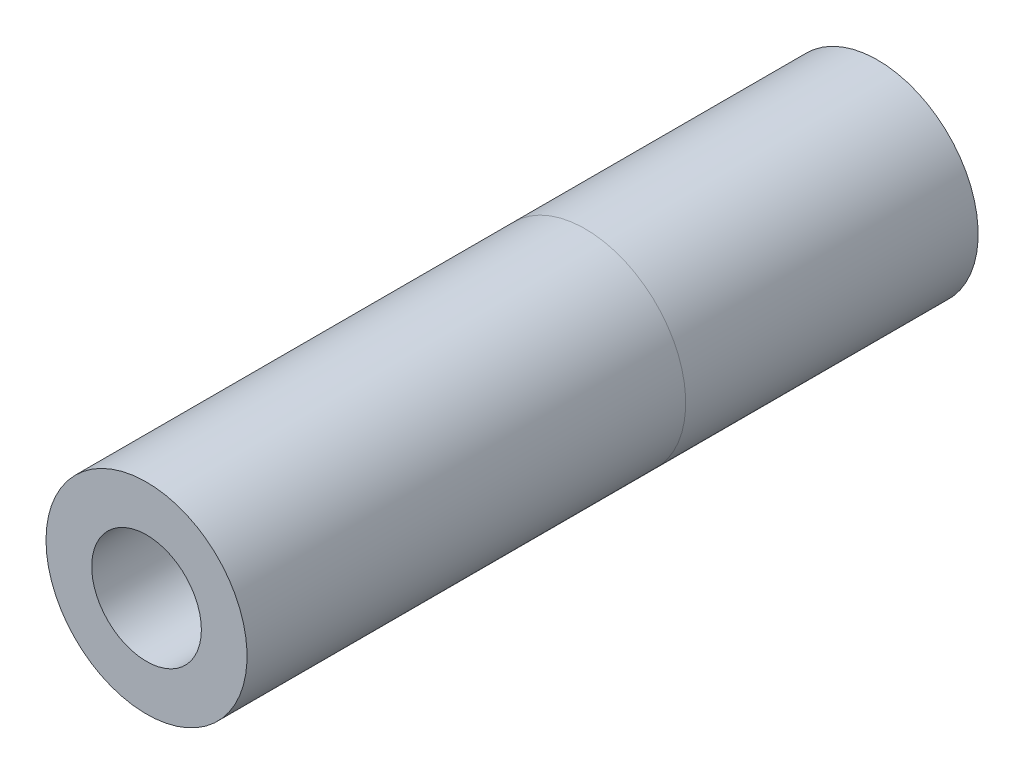
ISO-10303-21;
HEADER;
FILE_DESCRIPTION(('STEP AP214'),'2;1');
FILE_NAME('part.step','',(''),(''),'','','');
FILE_SCHEMA(('AUTOMOTIVE_DESIGN { 1 0 10303 214 1 1 1 1 }'));
ENDSEC;
DATA;
#1=APPLICATION_CONTEXT('core data for automotive mechanical design processes');
#2=APPLICATION_PROTOCOL_DEFINITION('international standard','automotive_design',2000,#1);
#3=PRODUCT_CONTEXT('',#1,'mechanical');
#4=PRODUCT('Part','Part','',(#3));
#5=PRODUCT_RELATED_PRODUCT_CATEGORY('part','',(#4));
#6=PRODUCT_DEFINITION_FORMATION('','',#4);
#7=PRODUCT_DEFINITION_CONTEXT('part definition',#1,'design');
#8=PRODUCT_DEFINITION('design','',#6,#7);
#9=PRODUCT_DEFINITION_SHAPE('','',#8);
#10=(LENGTH_UNIT() NAMED_UNIT(*) SI_UNIT(.MILLI.,.METRE.));
#11=(NAMED_UNIT(*) PLANE_ANGLE_UNIT() SI_UNIT($,.RADIAN.));
#12=(NAMED_UNIT(*) SI_UNIT($,.STERADIAN.) SOLID_ANGLE_UNIT());
#13=UNCERTAINTY_MEASURE_WITH_UNIT(LENGTH_MEASURE(1.E-05),#10,'distance_accuracy_value','');
#14=(GEOMETRIC_REPRESENTATION_CONTEXT(3) GLOBAL_UNCERTAINTY_ASSIGNED_CONTEXT((#13)) GLOBAL_UNIT_ASSIGNED_CONTEXT((#10,
#11,#12)) REPRESENTATION_CONTEXT('',''));
#15=CARTESIAN_POINT('',(0.,0.,0.));
#16=DIRECTION('',(0.,0.,1.));
#17=DIRECTION('',(1.,0.,0.));
#18=AXIS2_PLACEMENT_3D('',#15,#16,#17);
#19=CARTESIAN_POINT('',(0.,0.,0.));
#20=DIRECTION('',(0.,0.,-1.));
#21=DIRECTION('',(-1.,0.,0.));
#22=AXIS2_PLACEMENT_3D('',#19,#20,#21);
#23=PLANE('',#22);
#24=CARTESIAN_POINT('',(0.,0.,0.));
#25=DIRECTION('',(0.,0.,-1.));
#26=DIRECTION('',(-1.,0.,0.));
#27=AXIS2_PLACEMENT_3D('',#24,#25,#26);
#28=CIRCLE('',#27,4.7625);
#29=CARTESIAN_POINT('',(-4.7625,0.,0.));
#30=VERTEX_POINT('',#29);
#31=EDGE_CURVE('E79',#30,#30,#28,.T.);
#32=ORIENTED_EDGE('',*,*,#31,.F.);
#33=EDGE_LOOP('',(#32));
#34=FACE_BOUND('',#33,.T.);
#35=CARTESIAN_POINT('',(0.,0.,0.));
#36=DIRECTION('',(0.,0.,-1.));
#37=DIRECTION('',(-1.,0.,0.));
#38=AXIS2_PLACEMENT_3D('',#35,#36,#37);
#39=CIRCLE('',#38,8.73125);
#40=CARTESIAN_POINT('',(-8.73125,0.,0.));
#41=VERTEX_POINT('',#40);
#42=EDGE_CURVE('E75',#41,#41,#39,.T.);
#43=ORIENTED_EDGE('',*,*,#42,.T.);
#44=EDGE_LOOP('',(#43));
#45=FACE_BOUND('',#44,.T.);
#46=ADVANCED_FACE('F65',(#34,#45),#23,.T.);
#47=CARTESIAN_POINT('',(0.,0.,63.5));
#48=DIRECTION('',(0.,0.,-1.));
#49=DIRECTION('',(-1.,0.,0.));
#50=AXIS2_PLACEMENT_3D('',#47,#48,#49);
#51=PLANE('',#50);
#52=CARTESIAN_POINT('',(0.,0.,63.5));
#53=DIRECTION('',(0.,0.,-1.));
#54=DIRECTION('',(-1.,0.,0.));
#55=AXIS2_PLACEMENT_3D('',#52,#53,#54);
#56=CIRCLE('',#55,4.7625);
#57=CARTESIAN_POINT('',(4.7625,0.,63.5));
#58=VERTEX_POINT('',#57);
#59=EDGE_CURVE('E84',#58,#58,#56,.T.);
#60=ORIENTED_EDGE('',*,*,#59,.T.);
#61=EDGE_LOOP('',(#60));
#62=FACE_BOUND('',#61,.T.);
#63=CARTESIAN_POINT('',(0.,0.,63.5));
#64=DIRECTION('',(0.,0.,-1.));
#65=DIRECTION('',(-1.,0.,0.));
#66=AXIS2_PLACEMENT_3D('',#63,#64,#65);
#67=CIRCLE('',#66,8.73125);
#68=CARTESIAN_POINT('',(-8.73125,0.,63.5));
#69=VERTEX_POINT('',#68);
#70=EDGE_CURVE('E11',#69,#69,#67,.T.);
#71=ORIENTED_EDGE('',*,*,#70,.F.);
#72=EDGE_LOOP('',(#71));
#73=FACE_BOUND('',#72,.T.);
#74=ADVANCED_FACE('F91',(#62,#73),#51,.F.);
#75=CARTESIAN_POINT('',(0.,0.,0.));
#76=DIRECTION('',(0.,0.,1.));
#77=DIRECTION('',(1.,0.,0.));
#78=AXIS2_PLACEMENT_3D('',#75,#76,#77);
#79=CYLINDRICAL_SURFACE('',#78,8.73125);
#80=CARTESIAN_POINT('',(0.,0.,25.4));
#81=DIRECTION('',(0.,0.,-1.));
#82=DIRECTION('',(-1.,0.,0.));
#83=AXIS2_PLACEMENT_3D('',#80,#81,#82);
#84=CIRCLE('',#83,8.73125);
#85=CARTESIAN_POINT('',(-8.73125,0.,25.4));
#86=VERTEX_POINT('',#85);
#87=EDGE_CURVE('E71',#86,#86,#84,.T.);
#88=ORIENTED_EDGE('',*,*,#87,.T.);
#89=EDGE_LOOP('',(#88));
#90=FACE_BOUND('',#89,.T.);
#91=ORIENTED_EDGE('',*,*,#42,.F.);
#92=EDGE_LOOP('',(#91));
#93=FACE_BOUND('',#92,.T.);
#94=ADVANCED_FACE('F111',(#90,#93),#79,.T.);
#95=CARTESIAN_POINT('',(0.,0.,25.4));
#96=DIRECTION('',(0.,0.,1.));
#97=DIRECTION('',(1.,0.,0.));
#98=AXIS2_PLACEMENT_3D('',#95,#96,#97);
#99=CYLINDRICAL_SURFACE('',#98,8.73125);
#100=ORIENTED_EDGE('',*,*,#70,.T.);
#101=EDGE_LOOP('',(#100));
#102=FACE_BOUND('',#101,.T.);
#103=ORIENTED_EDGE('',*,*,#87,.F.);
#104=EDGE_LOOP('',(#103));
#105=FACE_BOUND('',#104,.T.);
#106=ADVANCED_FACE('F103',(#102,#105),#99,.T.);
#107=CARTESIAN_POINT('',(0.,0.,-1.));
#108=DIRECTION('',(0.,0.,1.));
#109=DIRECTION('',(1.,0.,0.));
#110=AXIS2_PLACEMENT_3D('',#107,#108,#109);
#111=CYLINDRICAL_SURFACE('',#110,4.7625);
#112=CARTESIAN_POINT('',(0.,0.,25.4));
#113=DIRECTION('',(0.,0.,-1.));
#114=DIRECTION('',(-1.,0.,0.));
#115=AXIS2_PLACEMENT_3D('',#112,#113,#114);
#116=CIRCLE('',#115,4.7625);
#117=CARTESIAN_POINT('',(4.7625,0.,25.4));
#118=VERTEX_POINT('',#117);
#119=EDGE_CURVE('E85',#118,#118,#116,.T.);
#120=ORIENTED_EDGE('',*,*,#119,.F.);
#121=EDGE_LOOP('',(#120));
#122=FACE_BOUND('',#121,.T.);
#123=ORIENTED_EDGE('',*,*,#31,.T.);
#124=EDGE_LOOP('',(#123));
#125=FACE_BOUND('',#124,.T.);
#126=ADVANCED_FACE('F97',(#122,#125),#111,.F.);
#127=CARTESIAN_POINT('',(0.,0.,25.4));
#128=DIRECTION('',(0.,0.,1.));
#129=DIRECTION('',(1.,0.,0.));
#130=AXIS2_PLACEMENT_3D('',#127,#128,#129);
#131=CYLINDRICAL_SURFACE('',#130,4.7625);
#132=CARTESIAN_POINT('',(4.7625,0.,63.5));
#133=CARTESIAN_POINT('',(4.7625,0.,63.103125));
#134=CARTESIAN_POINT('',(4.7625,0.,62.70625));
#135=CARTESIAN_POINT('',(4.7625,0.,61.9125));
#136=CARTESIAN_POINT('',(4.7625,0.,61.515625));
#137=CARTESIAN_POINT('',(4.7625,0.,60.721875));
#138=CARTESIAN_POINT('',(4.7625,0.,60.325));
#139=CARTESIAN_POINT('',(4.7625,0.,59.53125));
#140=CARTESIAN_POINT('',(4.7625,0.,59.134375));
#141=CARTESIAN_POINT('',(4.7625,0.,58.340625));
#142=CARTESIAN_POINT('',(4.7625,0.,57.94375));
#143=CARTESIAN_POINT('',(4.7625,0.,57.15));
#144=CARTESIAN_POINT('',(4.7625,0.,56.753125));
#145=CARTESIAN_POINT('',(4.7625,0.,55.959375));
#146=CARTESIAN_POINT('',(4.7625,0.,55.5625));
#147=CARTESIAN_POINT('',(4.7625,0.,54.76875));
#148=CARTESIAN_POINT('',(4.7625,0.,54.371875));
#149=CARTESIAN_POINT('',(4.7625,0.,53.578125));
#150=CARTESIAN_POINT('',(4.7625,0.,53.18125));
#151=CARTESIAN_POINT('',(4.7625,0.,52.3875));
#152=CARTESIAN_POINT('',(4.7625,0.,51.990625));
#153=CARTESIAN_POINT('',(4.7625,0.,51.196875));
#154=CARTESIAN_POINT('',(4.7625,0.,50.8));
#155=CARTESIAN_POINT('',(4.7625,0.,50.00625));
#156=CARTESIAN_POINT('',(4.7625,0.,49.609375));
#157=CARTESIAN_POINT('',(4.7625,0.,48.815625));
#158=CARTESIAN_POINT('',(4.7625,0.,48.41875));
#159=CARTESIAN_POINT('',(4.7625,0.,47.625));
#160=CARTESIAN_POINT('',(4.7625,0.,47.228125));
#161=CARTESIAN_POINT('',(4.7625,0.,46.434375));
#162=CARTESIAN_POINT('',(4.7625,0.,46.0375));
#163=CARTESIAN_POINT('',(4.7625,0.,45.24375));
#164=CARTESIAN_POINT('',(4.7625,0.,44.846875));
#165=CARTESIAN_POINT('',(4.7625,0.,44.053125));
#166=CARTESIAN_POINT('',(4.7625,0.,43.65625));
#167=CARTESIAN_POINT('',(4.7625,0.,42.8625));
#168=CARTESIAN_POINT('',(4.7625,0.,42.465625));
#169=CARTESIAN_POINT('',(4.7625,0.,41.671875));
#170=CARTESIAN_POINT('',(4.7625,0.,41.275));
#171=CARTESIAN_POINT('',(4.7625,0.,40.48125));
#172=CARTESIAN_POINT('',(4.7625,0.,40.084375));
#173=CARTESIAN_POINT('',(4.7625,0.,39.290625));
#174=CARTESIAN_POINT('',(4.7625,0.,38.89375));
#175=CARTESIAN_POINT('',(4.7625,0.,38.1));
#176=CARTESIAN_POINT('',(4.7625,0.,37.703125));
#177=CARTESIAN_POINT('',(4.7625,0.,36.909375));
#178=CARTESIAN_POINT('',(4.7625,0.,36.5125));
#179=CARTESIAN_POINT('',(4.7625,0.,35.71875));
#180=CARTESIAN_POINT('',(4.7625,0.,35.321875));
#181=CARTESIAN_POINT('',(4.7625,0.,34.528125));
#182=CARTESIAN_POINT('',(4.7625,0.,34.13125));
#183=CARTESIAN_POINT('',(4.7625,0.,33.3375));
#184=CARTESIAN_POINT('',(4.7625,0.,32.940625));
#185=CARTESIAN_POINT('',(4.7625,0.,32.146875));
#186=CARTESIAN_POINT('',(4.7625,0.,31.75));
#187=CARTESIAN_POINT('',(4.7625,0.,30.95625));
#188=CARTESIAN_POINT('',(4.7625,0.,30.559375));
#189=CARTESIAN_POINT('',(4.7625,0.,29.765625));
#190=CARTESIAN_POINT('',(4.7625,0.,29.36875));
#191=CARTESIAN_POINT('',(4.7625,0.,28.575));
#192=CARTESIAN_POINT('',(4.7625,0.,28.178125));
#193=CARTESIAN_POINT('',(4.7625,0.,27.384375));
#194=CARTESIAN_POINT('',(4.7625,0.,26.9875));
#195=CARTESIAN_POINT('',(4.7625,0.,26.19375));
#196=CARTESIAN_POINT('',(4.7625,0.,25.796875));
#197=CARTESIAN_POINT('',(4.7625,0.,25.4));
#198=B_SPLINE_CURVE_WITH_KNOTS('',3,(#132,#133,#134,#135,#136,#137,#138,#139,#140,#141,#142,
#143,#144,#145,#146,#147,#148,#149,#150,#151,#152,#153,#154,#155,#156,#157,#158,#159,#160,#161,
#162,#163,#164,#165,#166,#167,#168,#169,#170,#171,#172,#173,#174,#175,#176,#177,#178,#179,#180,
#181,#182,#183,#184,#185,#186,#187,#188,#189,#190,#191,#192,#193,#194,#195,#196,#197),
.UNSPECIFIED.,.F.,.F.,(4,2,2,2,2,2,2,2,2,2,2,2,2,2,2,2,2,2,2,2,2,2,2,2,2,2,2,2,2,2,2,2,4),(0.,
1.190625,2.38125,3.571875,4.7625,5.953125,7.14374999999999,8.33437499999999,9.52499999999999,
10.715625,11.90625,13.096875,14.2875,15.478125,16.66875,17.859375,19.05,20.240625,21.43125,
22.621875,23.8125,25.003125,26.19375,27.384375,28.575,29.765625,30.95625,32.146875,33.3375,
34.528125,35.71875,36.909375,38.1),.UNSPECIFIED.);
#199=EDGE_CURVE('BSEAM94',#58,#118,#198,.T.);
#200=ORIENTED_EDGE('',*,*,#59,.F.);
#201=ORIENTED_EDGE('',*,*,#119,.T.);
#202=ORIENTED_EDGE('',*,*,#199,.T.);
#203=ORIENTED_EDGE('',*,*,#199,.F.);
#204=EDGE_LOOP('',(#200,#202,#201,#203));
#205=FACE_BOUND('',#204,.T.);
#206=ADVANCED_FACE('F94',(#205),#131,.F.);
#207=CLOSED_SHELL('',(#46,#74,#94,#106,#126,#206));
#208=MANIFOLD_SOLID_BREP('B2',#207);
#209=ADVANCED_BREP_SHAPE_REPRESENTATION('',(#18,#208),#14);
#210=SHAPE_DEFINITION_REPRESENTATION(#9,#209);
ENDSEC;
END-ISO-10303-21;
